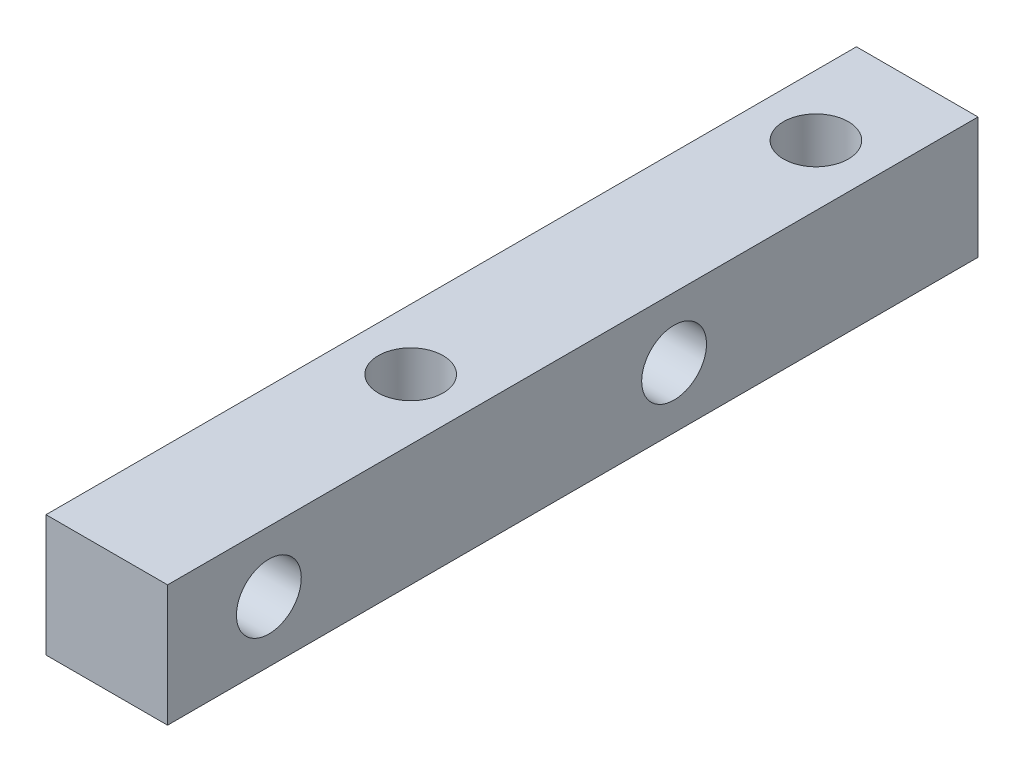
ISO-10303-21;
HEADER;
FILE_DESCRIPTION(('STEP AP214'),'2;1');
FILE_NAME('part.step','',(''),(''),'','','');
FILE_SCHEMA(('AUTOMOTIVE_DESIGN { 1 0 10303 214 1 1 1 1 }'));
ENDSEC;
DATA;
#1=APPLICATION_CONTEXT('core data for automotive mechanical design processes');
#2=APPLICATION_PROTOCOL_DEFINITION('international standard','automotive_design',2000,#1);
#3=PRODUCT_CONTEXT('',#1,'mechanical');
#4=PRODUCT('Part','Part','',(#3));
#5=PRODUCT_RELATED_PRODUCT_CATEGORY('part','',(#4));
#6=PRODUCT_DEFINITION_FORMATION('','',#4);
#7=PRODUCT_DEFINITION_CONTEXT('part definition',#1,'design');
#8=PRODUCT_DEFINITION('design','',#6,#7);
#9=PRODUCT_DEFINITION_SHAPE('','',#8);
#10=(LENGTH_UNIT() NAMED_UNIT(*) SI_UNIT(.MILLI.,.METRE.));
#11=(NAMED_UNIT(*) PLANE_ANGLE_UNIT() SI_UNIT($,.RADIAN.));
#12=(NAMED_UNIT(*) SI_UNIT($,.STERADIAN.) SOLID_ANGLE_UNIT());
#13=UNCERTAINTY_MEASURE_WITH_UNIT(LENGTH_MEASURE(1.E-05),#10,'distance_accuracy_value','');
#14=(GEOMETRIC_REPRESENTATION_CONTEXT(3) GLOBAL_UNCERTAINTY_ASSIGNED_CONTEXT((#13)) GLOBAL_UNIT_ASSIGNED_CONTEXT((#10,
#11,#12)) REPRESENTATION_CONTEXT('',''));
#15=CARTESIAN_POINT('',(0.,0.,0.));
#16=DIRECTION('',(0.,0.,1.));
#17=DIRECTION('',(1.,0.,0.));
#18=AXIS2_PLACEMENT_3D('',#15,#16,#17);
#19=CARTESIAN_POINT('',(0.,0.,40.));
#20=DIRECTION('',(1.,0.,0.));
#21=DIRECTION('',(0.,1.,0.));
#22=AXIS2_PLACEMENT_3D('',#19,#20,#21);
#23=PLANE('',#22);
#24=CARTESIAN_POINT('',(0.,-3.,35.));
#25=DIRECTION('',(1.,0.,0.));
#26=DIRECTION('',(0.,1.,0.));
#27=AXIS2_PLACEMENT_3D('',#24,#25,#26);
#28=CIRCLE('',#27,1.6);
#29=CARTESIAN_POINT('',(0.,-1.4,35.));
#30=VERTEX_POINT('',#29);
#31=EDGE_CURVE('E107',#30,#30,#28,.T.);
#32=ORIENTED_EDGE('',*,*,#31,.T.);
#33=EDGE_LOOP('',(#32));
#34=FACE_BOUND('',#33,.T.);
#35=CARTESIAN_POINT('',(0.,-3.,15.));
#36=DIRECTION('',(1.,0.,0.));
#37=DIRECTION('',(0.,1.,0.));
#38=AXIS2_PLACEMENT_3D('',#35,#36,#37);
#39=CIRCLE('',#38,1.6);
#40=CARTESIAN_POINT('',(0.,-1.4,15.));
#41=VERTEX_POINT('',#40);
#42=EDGE_CURVE('E116',#41,#41,#39,.T.);
#43=ORIENTED_EDGE('',*,*,#42,.T.);
#44=EDGE_LOOP('',(#43));
#45=FACE_BOUND('',#44,.T.);
#46=DIRECTION('',(0.,-1.,0.));
#47=VECTOR('',#46,1.);
#48=CARTESIAN_POINT('',(0.,0.,0.));
#49=LINE('',#48,#47);
#50=CARTESIAN_POINT('',(0.,0.,0.));
#51=VERTEX_POINT('',#50);
#52=CARTESIAN_POINT('',(0.,-6.,0.));
#53=VERTEX_POINT('',#52);
#54=EDGE_CURVE('E104',#51,#53,#49,.T.);
#55=ORIENTED_EDGE('',*,*,#54,.T.);
#56=DIRECTION('',(0.,0.,-1.));
#57=VECTOR('',#56,1.);
#58=CARTESIAN_POINT('',(0.,-6.,40.));
#59=LINE('',#58,#57);
#60=CARTESIAN_POINT('',(0.,-6.,40.));
#61=VERTEX_POINT('',#60);
#62=EDGE_CURVE('E11',#61,#53,#59,.T.);
#63=ORIENTED_EDGE('',*,*,#62,.F.);
#64=DIRECTION('',(0.,-1.,0.));
#65=VECTOR('',#64,1.);
#66=CARTESIAN_POINT('',(0.,0.,40.));
#67=LINE('',#66,#65);
#68=CARTESIAN_POINT('',(0.,0.,40.));
#69=VERTEX_POINT('',#68);
#70=EDGE_CURVE('E91',#69,#61,#67,.T.);
#71=ORIENTED_EDGE('',*,*,#70,.F.);
#72=DIRECTION('',(0.,0.,-1.));
#73=VECTOR('',#72,1.);
#74=CARTESIAN_POINT('',(0.,0.,40.));
#75=LINE('',#74,#73);
#76=EDGE_CURVE('E100',#69,#51,#75,.T.);
#77=ORIENTED_EDGE('',*,*,#76,.T.);
#78=EDGE_LOOP('',(#55,#63,#71,#77));
#79=FACE_BOUND('',#78,.T.);
#80=ADVANCED_FACE('F38',(#34,#45,#79),#23,.F.);
#81=CARTESIAN_POINT('',(0.,-6.,40.));
#82=DIRECTION('',(0.,1.,0.));
#83=DIRECTION('',(0.,0.,1.));
#84=AXIS2_PLACEMENT_3D('',#81,#82,#83);
#85=PLANE('',#84);
#86=CARTESIAN_POINT('',(3.,-6.,5.));
#87=DIRECTION('',(0.,1.,0.));
#88=DIRECTION('',(0.,0.,1.));
#89=AXIS2_PLACEMENT_3D('',#86,#87,#88);
#90=CIRCLE('',#89,1.6);
#91=CARTESIAN_POINT('',(3.,-6.,6.6));
#92=VERTEX_POINT('',#91);
#93=EDGE_CURVE('E117',#92,#92,#90,.T.);
#94=ORIENTED_EDGE('',*,*,#93,.T.);
#95=EDGE_LOOP('',(#94));
#96=FACE_BOUND('',#95,.T.);
#97=CARTESIAN_POINT('',(3.,-6.,25.));
#98=DIRECTION('',(0.,1.,0.));
#99=DIRECTION('',(0.,0.,1.));
#100=AXIS2_PLACEMENT_3D('',#97,#98,#99);
#101=CIRCLE('',#100,1.6);
#102=CARTESIAN_POINT('',(3.,-6.,26.6));
#103=VERTEX_POINT('',#102);
#104=EDGE_CURVE('E122',#103,#103,#101,.T.);
#105=ORIENTED_EDGE('',*,*,#104,.T.);
#106=EDGE_LOOP('',(#105));
#107=FACE_BOUND('',#106,.T.);
#108=DIRECTION('',(1.,0.,0.));
#109=VECTOR('',#108,1.);
#110=CARTESIAN_POINT('',(0.,-6.,0.));
#111=LINE('',#110,#109);
#112=CARTESIAN_POINT('',(6.,-6.,0.));
#113=VERTEX_POINT('',#112);
#114=EDGE_CURVE('E95',#53,#113,#111,.T.);
#115=ORIENTED_EDGE('',*,*,#114,.T.);
#116=DIRECTION('',(0.,0.,-1.));
#117=VECTOR('',#116,1.);
#118=CARTESIAN_POINT('',(6.,-6.,40.));
#119=LINE('',#118,#117);
#120=CARTESIAN_POINT('',(6.,-6.,40.));
#121=VERTEX_POINT('',#120);
#122=EDGE_CURVE('E47',#121,#113,#119,.T.);
#123=ORIENTED_EDGE('',*,*,#122,.F.);
#124=DIRECTION('',(1.,0.,0.));
#125=VECTOR('',#124,1.);
#126=CARTESIAN_POINT('',(0.,-6.,40.));
#127=LINE('',#126,#125);
#128=EDGE_CURVE('E86',#61,#121,#127,.T.);
#129=ORIENTED_EDGE('',*,*,#128,.F.);
#130=ORIENTED_EDGE('',*,*,#62,.T.);
#131=EDGE_LOOP('',(#115,#123,#129,#130));
#132=FACE_BOUND('',#131,.T.);
#133=ADVANCED_FACE('F94',(#96,#107,#132),#85,.F.);
#134=CARTESIAN_POINT('',(6.,0.,40.));
#135=DIRECTION('',(-1.,0.,0.));
#136=DIRECTION('',(0.,-1.,0.));
#137=AXIS2_PLACEMENT_3D('',#134,#135,#136);
#138=PLANE('',#137);
#139=CARTESIAN_POINT('',(6.,-3.,35.));
#140=DIRECTION('',(-1.,0.,0.));
#141=DIRECTION('',(0.,-1.,0.));
#142=AXIS2_PLACEMENT_3D('',#139,#140,#141);
#143=CIRCLE('',#142,1.6);
#144=CARTESIAN_POINT('',(6.,-4.6,35.));
#145=VERTEX_POINT('',#144);
#146=EDGE_CURVE('E118',#145,#145,#143,.T.);
#147=ORIENTED_EDGE('',*,*,#146,.T.);
#148=EDGE_LOOP('',(#147));
#149=FACE_BOUND('',#148,.T.);
#150=CARTESIAN_POINT('',(6.,-3.,15.));
#151=DIRECTION('',(-1.,0.,0.));
#152=DIRECTION('',(0.,-1.,0.));
#153=AXIS2_PLACEMENT_3D('',#150,#151,#152);
#154=CIRCLE('',#153,1.6);
#155=CARTESIAN_POINT('',(6.,-4.6,15.));
#156=VERTEX_POINT('',#155);
#157=EDGE_CURVE('E113',#156,#156,#154,.T.);
#158=ORIENTED_EDGE('',*,*,#157,.T.);
#159=EDGE_LOOP('',(#158));
#160=FACE_BOUND('',#159,.T.);
#161=DIRECTION('',(0.,1.,0.));
#162=VECTOR('',#161,1.);
#163=CARTESIAN_POINT('',(6.,0.,0.));
#164=LINE('',#163,#162);
#165=CARTESIAN_POINT('',(6.,0.,0.));
#166=VERTEX_POINT('',#165);
#167=EDGE_CURVE('E73',#113,#166,#164,.T.);
#168=ORIENTED_EDGE('',*,*,#167,.T.);
#169=DIRECTION('',(0.,0.,-1.));
#170=VECTOR('',#169,1.);
#171=CARTESIAN_POINT('',(6.,0.,40.));
#172=LINE('',#171,#170);
#173=CARTESIAN_POINT('',(6.,0.,40.));
#174=VERTEX_POINT('',#173);
#175=EDGE_CURVE('E96',#174,#166,#172,.T.);
#176=ORIENTED_EDGE('',*,*,#175,.F.);
#177=DIRECTION('',(0.,1.,0.));
#178=VECTOR('',#177,1.);
#179=CARTESIAN_POINT('',(6.,0.,40.));
#180=LINE('',#179,#178);
#181=EDGE_CURVE('E89',#121,#174,#180,.T.);
#182=ORIENTED_EDGE('',*,*,#181,.F.);
#183=ORIENTED_EDGE('',*,*,#122,.T.);
#184=EDGE_LOOP('',(#168,#176,#182,#183));
#185=FACE_BOUND('',#184,.T.);
#186=ADVANCED_FACE('F98',(#149,#160,#185),#138,.F.);
#187=CARTESIAN_POINT('',(0.,0.,40.));
#188=DIRECTION('',(0.,-1.,0.));
#189=DIRECTION('',(0.,0.,-1.));
#190=AXIS2_PLACEMENT_3D('',#187,#188,#189);
#191=PLANE('',#190);
#192=CARTESIAN_POINT('',(3.,0.,5.));
#193=DIRECTION('',(0.,-1.,0.));
#194=DIRECTION('',(0.,0.,-1.));
#195=AXIS2_PLACEMENT_3D('',#192,#193,#194);
#196=CIRCLE('',#195,1.6);
#197=CARTESIAN_POINT('',(3.,0.,3.4));
#198=VERTEX_POINT('',#197);
#199=EDGE_CURVE('E41',#198,#198,#196,.T.);
#200=ORIENTED_EDGE('',*,*,#199,.T.);
#201=EDGE_LOOP('',(#200));
#202=FACE_BOUND('',#201,.T.);
#203=CARTESIAN_POINT('',(3.,0.,25.));
#204=DIRECTION('',(0.,-1.,0.));
#205=DIRECTION('',(0.,0.,-1.));
#206=AXIS2_PLACEMENT_3D('',#203,#204,#205);
#207=CIRCLE('',#206,1.6);
#208=CARTESIAN_POINT('',(3.,0.,23.4));
#209=VERTEX_POINT('',#208);
#210=EDGE_CURVE('E120',#209,#209,#207,.T.);
#211=ORIENTED_EDGE('',*,*,#210,.T.);
#212=EDGE_LOOP('',(#211));
#213=FACE_BOUND('',#212,.T.);
#214=DIRECTION('',(-1.,0.,0.));
#215=VECTOR('',#214,1.);
#216=CARTESIAN_POINT('',(0.,0.,0.));
#217=LINE('',#216,#215);
#218=EDGE_CURVE('E79',#166,#51,#217,.T.);
#219=ORIENTED_EDGE('',*,*,#218,.T.);
#220=ORIENTED_EDGE('',*,*,#76,.F.);
#221=DIRECTION('',(-1.,0.,0.));
#222=VECTOR('',#221,1.);
#223=CARTESIAN_POINT('',(0.,0.,40.));
#224=LINE('',#223,#222);
#225=EDGE_CURVE('E56',#174,#69,#224,.T.);
#226=ORIENTED_EDGE('',*,*,#225,.F.);
#227=ORIENTED_EDGE('',*,*,#175,.T.);
#228=EDGE_LOOP('',(#219,#220,#226,#227));
#229=FACE_BOUND('',#228,.T.);
#230=ADVANCED_FACE('F165',(#202,#213,#229),#191,.F.);
#231=CARTESIAN_POINT('',(0.,0.,40.));
#232=DIRECTION('',(0.,0.,1.));
#233=DIRECTION('',(1.,0.,0.));
#234=AXIS2_PLACEMENT_3D('',#231,#232,#233);
#235=PLANE('',#234);
#236=ORIENTED_EDGE('',*,*,#70,.T.);
#237=ORIENTED_EDGE('',*,*,#128,.T.);
#238=ORIENTED_EDGE('',*,*,#181,.T.);
#239=ORIENTED_EDGE('',*,*,#225,.T.);
#240=EDGE_LOOP('',(#236,#237,#238,#239));
#241=FACE_BOUND('',#240,.T.);
#242=ADVANCED_FACE('F87',(#241),#235,.T.);
#243=CARTESIAN_POINT('',(0.,0.,0.));
#244=DIRECTION('',(0.,0.,1.));
#245=DIRECTION('',(1.,0.,0.));
#246=AXIS2_PLACEMENT_3D('',#243,#244,#245);
#247=PLANE('',#246);
#248=ORIENTED_EDGE('',*,*,#54,.F.);
#249=ORIENTED_EDGE('',*,*,#218,.F.);
#250=ORIENTED_EDGE('',*,*,#167,.F.);
#251=ORIENTED_EDGE('',*,*,#114,.F.);
#252=EDGE_LOOP('',(#248,#249,#250,#251));
#253=FACE_BOUND('',#252,.T.);
#254=ADVANCED_FACE('F153',(#253),#247,.F.);
#255=CARTESIAN_POINT('',(-18.,-3.,15.));
#256=DIRECTION('',(1.,0.,0.));
#257=DIRECTION('',(0.,0.,-1.));
#258=AXIS2_PLACEMENT_3D('',#255,#256,#257);
#259=CYLINDRICAL_SURFACE('',#258,1.6);
#260=ORIENTED_EDGE('',*,*,#157,.F.);
#261=EDGE_LOOP('',(#260));
#262=FACE_BOUND('',#261,.T.);
#263=ORIENTED_EDGE('',*,*,#42,.F.);
#264=EDGE_LOOP('',(#263));
#265=FACE_BOUND('',#264,.T.);
#266=ADVANCED_FACE('F143',(#262,#265),#259,.F.);
#267=CARTESIAN_POINT('',(-18.,-3.,35.));
#268=DIRECTION('',(1.,0.,0.));
#269=DIRECTION('',(0.,0.,-1.));
#270=AXIS2_PLACEMENT_3D('',#267,#268,#269);
#271=CYLINDRICAL_SURFACE('',#270,1.6);
#272=ORIENTED_EDGE('',*,*,#146,.F.);
#273=EDGE_LOOP('',(#272));
#274=FACE_BOUND('',#273,.T.);
#275=ORIENTED_EDGE('',*,*,#31,.F.);
#276=EDGE_LOOP('',(#275));
#277=FACE_BOUND('',#276,.T.);
#278=ADVANCED_FACE('F140',(#274,#277),#271,.F.);
#279=CARTESIAN_POINT('',(3.,-24.,25.));
#280=DIRECTION('',(0.,1.,0.));
#281=DIRECTION('',(0.,0.,1.));
#282=AXIS2_PLACEMENT_3D('',#279,#280,#281);
#283=CYLINDRICAL_SURFACE('',#282,1.6);
#284=ORIENTED_EDGE('',*,*,#210,.F.);
#285=EDGE_LOOP('',(#284));
#286=FACE_BOUND('',#285,.T.);
#287=ORIENTED_EDGE('',*,*,#104,.F.);
#288=EDGE_LOOP('',(#287));
#289=FACE_BOUND('',#288,.T.);
#290=ADVANCED_FACE('F142',(#286,#289),#283,.F.);
#291=CARTESIAN_POINT('',(3.,-24.,5.));
#292=DIRECTION('',(0.,1.,0.));
#293=DIRECTION('',(0.,0.,1.));
#294=AXIS2_PLACEMENT_3D('',#291,#292,#293);
#295=CYLINDRICAL_SURFACE('',#294,1.6);
#296=ORIENTED_EDGE('',*,*,#199,.F.);
#297=EDGE_LOOP('',(#296));
#298=FACE_BOUND('',#297,.T.);
#299=ORIENTED_EDGE('',*,*,#93,.F.);
#300=EDGE_LOOP('',(#299));
#301=FACE_BOUND('',#300,.T.);
#302=ADVANCED_FACE('F150',(#298,#301),#295,.F.);
#303=CLOSED_SHELL('',(#80,#133,#186,#230,#242,#254,#266,#278,#290,#302));
#304=MANIFOLD_SOLID_BREP('B2',#303);
#305=ADVANCED_BREP_SHAPE_REPRESENTATION('',(#18,#304),#14);
#306=SHAPE_DEFINITION_REPRESENTATION(#9,#305);
ENDSEC;
END-ISO-10303-21;
